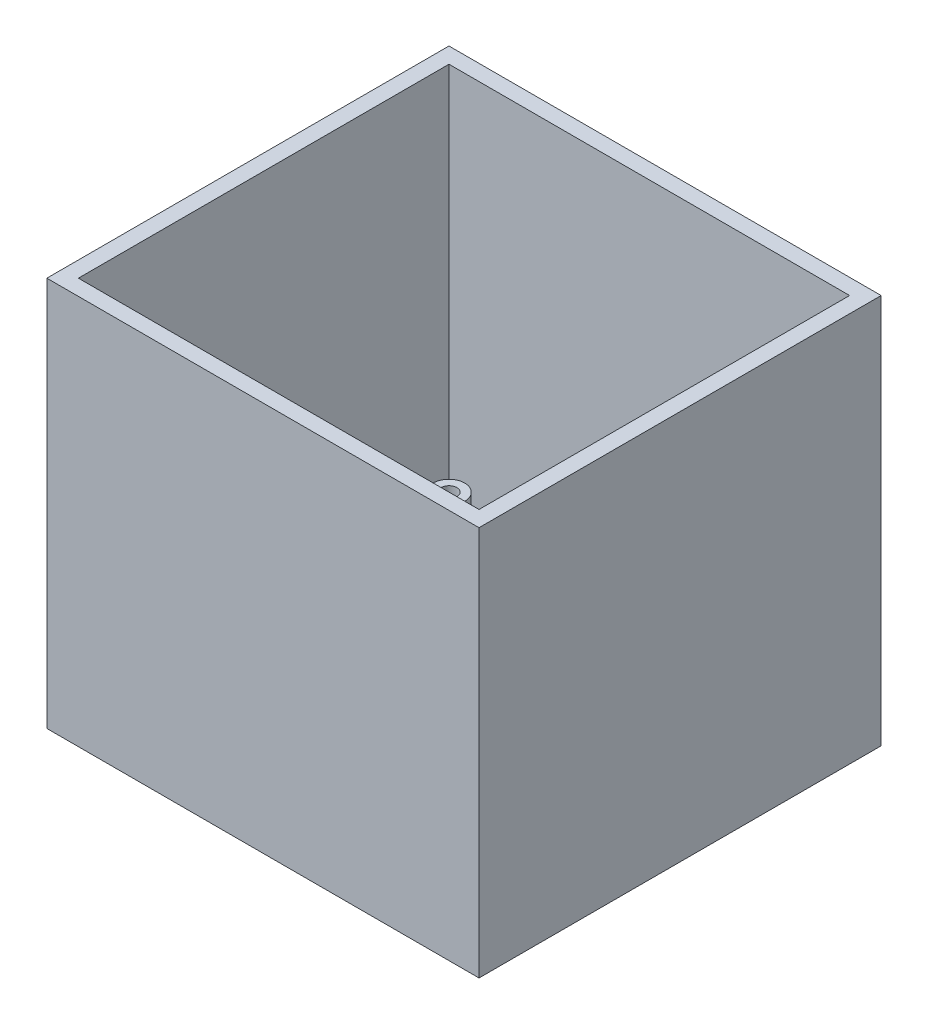
ISO-10303-21;
HEADER;
FILE_DESCRIPTION(('STEP AP214'),'2;1');
FILE_NAME('part.step','',(''),(''),'','','');
FILE_SCHEMA(('AUTOMOTIVE_DESIGN { 1 0 10303 214 1 1 1 1 }'));
ENDSEC;
DATA;
#1=APPLICATION_CONTEXT('core data for automotive mechanical design processes');
#2=APPLICATION_PROTOCOL_DEFINITION('international standard','automotive_design',2000,#1);
#3=PRODUCT_CONTEXT('',#1,'mechanical');
#4=PRODUCT('Part','Part','',(#3));
#5=PRODUCT_RELATED_PRODUCT_CATEGORY('part','',(#4));
#6=PRODUCT_DEFINITION_FORMATION('','',#4);
#7=PRODUCT_DEFINITION_CONTEXT('part definition',#1,'design');
#8=PRODUCT_DEFINITION('design','',#6,#7);
#9=PRODUCT_DEFINITION_SHAPE('','',#8);
#10=(LENGTH_UNIT() NAMED_UNIT(*) SI_UNIT(.MILLI.,.METRE.));
#11=(NAMED_UNIT(*) PLANE_ANGLE_UNIT() SI_UNIT($,.RADIAN.));
#12=(NAMED_UNIT(*) SI_UNIT($,.STERADIAN.) SOLID_ANGLE_UNIT());
#13=UNCERTAINTY_MEASURE_WITH_UNIT(LENGTH_MEASURE(1.E-05),#10,'distance_accuracy_value','');
#14=(GEOMETRIC_REPRESENTATION_CONTEXT(3) GLOBAL_UNCERTAINTY_ASSIGNED_CONTEXT((#13)) GLOBAL_UNIT_ASSIGNED_CONTEXT((#10,
#11,#12)) REPRESENTATION_CONTEXT('',''));
#15=CARTESIAN_POINT('',(0.,0.,0.));
#16=DIRECTION('',(0.,0.,1.));
#17=DIRECTION('',(1.,0.,0.));
#18=AXIS2_PLACEMENT_3D('',#15,#16,#17);
#19=CARTESIAN_POINT('',(0.,2.,0.));
#20=DIRECTION('',(0.,-1.,0.));
#21=DIRECTION('',(0.,0.,-1.));
#22=AXIS2_PLACEMENT_3D('',#19,#20,#21);
#23=PLANE('',#22);
#24=DIRECTION('',(1.,0.,0.));
#25=VECTOR('',#24,1.);
#26=CARTESIAN_POINT('',(-25.400000048,2.,23.495000048));
#27=LINE('',#26,#25);
#28=CARTESIAN_POINT('',(-25.400000048,2.,23.495000048));
#29=VERTEX_POINT('',#28);
#30=CARTESIAN_POINT('',(25.400000048,2.,23.495000048));
#31=VERTEX_POINT('',#30);
#32=EDGE_CURVE('E117',#29,#31,#27,.T.);
#33=ORIENTED_EDGE('',*,*,#32,.T.);
#34=DIRECTION('',(0.,0.,-1.));
#35=VECTOR('',#34,1.);
#36=CARTESIAN_POINT('',(25.400000048,2.,23.495000048));
#37=LINE('',#36,#35);
#38=CARTESIAN_POINT('',(25.400000048,2.,-23.495000048));
#39=VERTEX_POINT('',#38);
#40=EDGE_CURVE('E140',#31,#39,#37,.T.);
#41=ORIENTED_EDGE('',*,*,#40,.T.);
#42=DIRECTION('',(-1.,0.,0.));
#43=VECTOR('',#42,1.);
#44=CARTESIAN_POINT('',(-25.400000048,2.,-23.495000048));
#45=LINE('',#44,#43);
#46=CARTESIAN_POINT('',(-25.400000048,2.,-23.495000048));
#47=VERTEX_POINT('',#46);
#48=EDGE_CURVE('E123',#39,#47,#45,.T.);
#49=ORIENTED_EDGE('',*,*,#48,.T.);
#50=DIRECTION('',(0.,0.,1.));
#51=VECTOR('',#50,1.);
#52=CARTESIAN_POINT('',(-25.400000048,2.,23.495000048));
#53=LINE('',#52,#51);
#54=EDGE_CURVE('E145',#47,#29,#53,.T.);
#55=ORIENTED_EDGE('',*,*,#54,.T.);
#56=EDGE_LOOP('',(#33,#41,#49,#55));
#57=FACE_BOUND('',#56,.T.);
#58=CARTESIAN_POINT('',(-22.8599999999996,2.,20.955));
#59=DIRECTION('',(0.,-1.,0.));
#60=DIRECTION('',(0.,0.,-1.));
#61=AXIS2_PLACEMENT_3D('',#58,#59,#60);
#62=CIRCLE('',#61,2.);
#63=CARTESIAN_POINT('',(-22.8599999999996,2.,18.955));
#64=VERTEX_POINT('',#63);
#65=EDGE_CURVE('E11',#64,#64,#62,.F.);
#66=ORIENTED_EDGE('',*,*,#65,.F.);
#67=EDGE_LOOP('',(#66));
#68=FACE_BOUND('',#67,.T.);
#69=CARTESIAN_POINT('',(22.8600000000004,2.,20.955));
#70=DIRECTION('',(0.,-1.,0.));
#71=DIRECTION('',(0.,0.,-1.));
#72=AXIS2_PLACEMENT_3D('',#69,#70,#71);
#73=CIRCLE('',#72,2.);
#74=CARTESIAN_POINT('',(22.8600000000004,2.,18.955));
#75=VERTEX_POINT('',#74);
#76=EDGE_CURVE('E48',#75,#75,#73,.F.);
#77=ORIENTED_EDGE('',*,*,#76,.F.);
#78=EDGE_LOOP('',(#77));
#79=FACE_BOUND('',#78,.T.);
#80=CARTESIAN_POINT('',(22.86,2.,-20.955));
#81=DIRECTION('',(0.,-1.,0.));
#82=DIRECTION('',(0.,0.,-1.));
#83=AXIS2_PLACEMENT_3D('',#80,#81,#82);
#84=CIRCLE('',#83,2.);
#85=CARTESIAN_POINT('',(22.86,2.,-22.955));
#86=VERTEX_POINT('',#85);
#87=EDGE_CURVE('E252',#86,#86,#84,.F.);
#88=ORIENTED_EDGE('',*,*,#87,.F.);
#89=EDGE_LOOP('',(#88));
#90=FACE_BOUND('',#89,.T.);
#91=CARTESIAN_POINT('',(-22.86,2.,-20.955));
#92=DIRECTION('',(0.,-1.,0.));
#93=DIRECTION('',(0.,0.,-1.));
#94=AXIS2_PLACEMENT_3D('',#91,#92,#93);
#95=CIRCLE('',#94,2.);
#96=CARTESIAN_POINT('',(-22.86,2.,-22.955));
#97=VERTEX_POINT('',#96);
#98=EDGE_CURVE('E248',#97,#97,#95,.F.);
#99=ORIENTED_EDGE('',*,*,#98,.F.);
#100=EDGE_LOOP('',(#99));
#101=FACE_BOUND('',#100,.T.);
#102=ADVANCED_FACE('F39',(#57,#68,#79,#90,#101),#23,.F.);
#103=CARTESIAN_POINT('',(-22.86,5.,-20.955));
#104=DIRECTION('',(0.,1.,0.));
#105=DIRECTION('',(0.,0.,1.));
#106=AXIS2_PLACEMENT_3D('',#103,#104,#105);
#107=PLANE('',#106);
#108=CARTESIAN_POINT('',(-22.86,5.,-20.955));
#109=DIRECTION('',(0.,1.,0.));
#110=DIRECTION('',(0.,0.,1.));
#111=AXIS2_PLACEMENT_3D('',#108,#109,#110);
#112=CIRCLE('',#111,2.);
#113=CARTESIAN_POINT('',(-22.86,5.,-18.955));
#114=VERTEX_POINT('',#113);
#115=EDGE_CURVE('E215',#114,#114,#112,.T.);
#116=ORIENTED_EDGE('',*,*,#115,.T.);
#117=EDGE_LOOP('',(#116));
#118=FACE_BOUND('',#117,.T.);
#119=CARTESIAN_POINT('',(-22.86,5.,-20.955));
#120=DIRECTION('',(0.,1.,0.));
#121=DIRECTION('',(0.,0.,1.));
#122=AXIS2_PLACEMENT_3D('',#119,#120,#121);
#123=CIRCLE('',#122,1.);
#124=CARTESIAN_POINT('',(-22.86,5.,-19.955));
#125=VERTEX_POINT('',#124);
#126=EDGE_CURVE('E211',#125,#125,#123,.T.);
#127=ORIENTED_EDGE('',*,*,#126,.F.);
#128=EDGE_LOOP('',(#127));
#129=FACE_BOUND('',#128,.T.);
#130=ADVANCED_FACE('F263',(#118,#129),#107,.T.);
#131=CARTESIAN_POINT('',(-22.86,5.,-20.955));
#132=DIRECTION('',(0.,-1.,0.));
#133=DIRECTION('',(0.,0.,-1.));
#134=AXIS2_PLACEMENT_3D('',#131,#132,#133);
#135=CYLINDRICAL_SURFACE('',#134,2.);
#136=ORIENTED_EDGE('',*,*,#115,.F.);
#137=EDGE_LOOP('',(#136));
#138=FACE_BOUND('',#137,.T.);
#139=ORIENTED_EDGE('',*,*,#98,.T.);
#140=EDGE_LOOP('',(#139));
#141=FACE_BOUND('',#140,.T.);
#142=ADVANCED_FACE('F272',(#138,#141),#135,.T.);
#143=CARTESIAN_POINT('',(-22.86,5.,-20.955));
#144=DIRECTION('',(0.,-1.,0.));
#145=DIRECTION('',(0.,0.,-1.));
#146=AXIS2_PLACEMENT_3D('',#143,#144,#145);
#147=CYLINDRICAL_SURFACE('',#146,1.);
#148=ORIENTED_EDGE('',*,*,#126,.T.);
#149=EDGE_LOOP('',(#148));
#150=FACE_BOUND('',#149,.T.);
#151=CARTESIAN_POINT('',(-22.86,2.,-20.955));
#152=DIRECTION('',(0.,1.,0.));
#153=DIRECTION('',(0.,0.,1.));
#154=AXIS2_PLACEMENT_3D('',#151,#152,#153);
#155=CIRCLE('',#154,1.);
#156=CARTESIAN_POINT('',(-22.86,2.,-19.955));
#157=VERTEX_POINT('',#156);
#158=EDGE_CURVE('E210',#157,#157,#155,.T.);
#159=ORIENTED_EDGE('',*,*,#158,.F.);
#160=EDGE_LOOP('',(#159));
#161=FACE_BOUND('',#160,.T.);
#162=ADVANCED_FACE('F274',(#150,#161),#147,.F.);
#163=ORIENTED_EDGE('',*,*,#158,.T.);
#164=EDGE_LOOP('',(#163));
#165=FACE_BOUND('',#164,.T.);
#166=ADVANCED_FACE('F267',(#165),#23,.F.);
#167=CARTESIAN_POINT('',(22.86,5.,-20.955));
#168=DIRECTION('',(0.,1.,0.));
#169=DIRECTION('',(0.,0.,1.));
#170=AXIS2_PLACEMENT_3D('',#167,#168,#169);
#171=PLANE('',#170);
#172=CARTESIAN_POINT('',(22.86,5.,-20.955));
#173=DIRECTION('',(0.,1.,0.));
#174=DIRECTION('',(0.,0.,1.));
#175=AXIS2_PLACEMENT_3D('',#172,#173,#174);
#176=CIRCLE('',#175,2.);
#177=CARTESIAN_POINT('',(22.86,5.,-18.955));
#178=VERTEX_POINT('',#177);
#179=EDGE_CURVE('E203',#178,#178,#176,.T.);
#180=ORIENTED_EDGE('',*,*,#179,.T.);
#181=EDGE_LOOP('',(#180));
#182=FACE_BOUND('',#181,.T.);
#183=CARTESIAN_POINT('',(22.86,5.,-20.955));
#184=DIRECTION('',(0.,1.,0.));
#185=DIRECTION('',(0.,0.,1.));
#186=AXIS2_PLACEMENT_3D('',#183,#184,#185);
#187=CIRCLE('',#186,1.);
#188=CARTESIAN_POINT('',(22.86,5.,-19.955));
#189=VERTEX_POINT('',#188);
#190=EDGE_CURVE('E199',#189,#189,#187,.T.);
#191=ORIENTED_EDGE('',*,*,#190,.F.);
#192=EDGE_LOOP('',(#191));
#193=FACE_BOUND('',#192,.T.);
#194=ADVANCED_FACE('F352',(#182,#193),#171,.T.);
#195=CARTESIAN_POINT('',(22.86,5.,-20.955));
#196=DIRECTION('',(0.,-1.,0.));
#197=DIRECTION('',(0.,0.,-1.));
#198=AXIS2_PLACEMENT_3D('',#195,#196,#197);
#199=CYLINDRICAL_SURFACE('',#198,2.);
#200=ORIENTED_EDGE('',*,*,#179,.F.);
#201=EDGE_LOOP('',(#200));
#202=FACE_BOUND('',#201,.T.);
#203=ORIENTED_EDGE('',*,*,#87,.T.);
#204=EDGE_LOOP('',(#203));
#205=FACE_BOUND('',#204,.T.);
#206=ADVANCED_FACE('F350',(#202,#205),#199,.T.);
#207=CARTESIAN_POINT('',(22.86,5.,-20.955));
#208=DIRECTION('',(0.,-1.,0.));
#209=DIRECTION('',(0.,0.,-1.));
#210=AXIS2_PLACEMENT_3D('',#207,#208,#209);
#211=CYLINDRICAL_SURFACE('',#210,1.);
#212=ORIENTED_EDGE('',*,*,#190,.T.);
#213=EDGE_LOOP('',(#212));
#214=FACE_BOUND('',#213,.T.);
#215=CARTESIAN_POINT('',(22.86,2.,-20.955));
#216=DIRECTION('',(0.,1.,0.));
#217=DIRECTION('',(0.,0.,1.));
#218=AXIS2_PLACEMENT_3D('',#215,#216,#217);
#219=CIRCLE('',#218,1.);
#220=CARTESIAN_POINT('',(22.86,2.,-19.955));
#221=VERTEX_POINT('',#220);
#222=EDGE_CURVE('E198',#221,#221,#219,.T.);
#223=ORIENTED_EDGE('',*,*,#222,.F.);
#224=EDGE_LOOP('',(#223));
#225=FACE_BOUND('',#224,.T.);
#226=ADVANCED_FACE('F347',(#214,#225),#211,.F.);
#227=ORIENTED_EDGE('',*,*,#222,.T.);
#228=EDGE_LOOP('',(#227));
#229=FACE_BOUND('',#228,.T.);
#230=ADVANCED_FACE('F342',(#229),#23,.F.);
#231=CARTESIAN_POINT('',(22.8600000000004,5.,20.955));
#232=DIRECTION('',(0.,1.,0.));
#233=DIRECTION('',(0.,0.,1.));
#234=AXIS2_PLACEMENT_3D('',#231,#232,#233);
#235=PLANE('',#234);
#236=CARTESIAN_POINT('',(22.8600000000004,5.,20.955));
#237=DIRECTION('',(0.,1.,0.));
#238=DIRECTION('',(0.,0.,1.));
#239=AXIS2_PLACEMENT_3D('',#236,#237,#238);
#240=CIRCLE('',#239,2.);
#241=CARTESIAN_POINT('',(22.8600000000004,5.,22.955));
#242=VERTEX_POINT('',#241);
#243=EDGE_CURVE('E191',#242,#242,#240,.T.);
#244=ORIENTED_EDGE('',*,*,#243,.T.);
#245=EDGE_LOOP('',(#244));
#246=FACE_BOUND('',#245,.T.);
#247=CARTESIAN_POINT('',(22.8600000000004,5.,20.955));
#248=DIRECTION('',(0.,1.,0.));
#249=DIRECTION('',(0.,0.,1.));
#250=AXIS2_PLACEMENT_3D('',#247,#248,#249);
#251=CIRCLE('',#250,1.);
#252=CARTESIAN_POINT('',(22.8600000000004,5.,21.955));
#253=VERTEX_POINT('',#252);
#254=EDGE_CURVE('E187',#253,#253,#251,.T.);
#255=ORIENTED_EDGE('',*,*,#254,.F.);
#256=EDGE_LOOP('',(#255));
#257=FACE_BOUND('',#256,.T.);
#258=ADVANCED_FACE('F339',(#246,#257),#235,.T.);
#259=CARTESIAN_POINT('',(22.8600000000004,5.,20.955));
#260=DIRECTION('',(0.,-1.,0.));
#261=DIRECTION('',(0.,0.,-1.));
#262=AXIS2_PLACEMENT_3D('',#259,#260,#261);
#263=CYLINDRICAL_SURFACE('',#262,2.);
#264=ORIENTED_EDGE('',*,*,#243,.F.);
#265=EDGE_LOOP('',(#264));
#266=FACE_BOUND('',#265,.T.);
#267=ORIENTED_EDGE('',*,*,#76,.T.);
#268=EDGE_LOOP('',(#267));
#269=FACE_BOUND('',#268,.T.);
#270=ADVANCED_FACE('F259',(#266,#269),#263,.T.);
#271=CARTESIAN_POINT('',(22.8600000000004,5.,20.955));
#272=DIRECTION('',(0.,-1.,0.));
#273=DIRECTION('',(0.,0.,-1.));
#274=AXIS2_PLACEMENT_3D('',#271,#272,#273);
#275=CYLINDRICAL_SURFACE('',#274,1.);
#276=ORIENTED_EDGE('',*,*,#254,.T.);
#277=EDGE_LOOP('',(#276));
#278=FACE_BOUND('',#277,.T.);
#279=CARTESIAN_POINT('',(22.8600000000004,2.,20.955));
#280=DIRECTION('',(0.,1.,0.));
#281=DIRECTION('',(0.,0.,1.));
#282=AXIS2_PLACEMENT_3D('',#279,#280,#281);
#283=CIRCLE('',#282,1.);
#284=CARTESIAN_POINT('',(22.8600000000004,2.,21.955));
#285=VERTEX_POINT('',#284);
#286=EDGE_CURVE('E186',#285,#285,#283,.T.);
#287=ORIENTED_EDGE('',*,*,#286,.F.);
#288=EDGE_LOOP('',(#287));
#289=FACE_BOUND('',#288,.T.);
#290=ADVANCED_FACE('F335',(#278,#289),#275,.F.);
#291=ORIENTED_EDGE('',*,*,#286,.T.);
#292=EDGE_LOOP('',(#291));
#293=FACE_BOUND('',#292,.T.);
#294=ADVANCED_FACE('F321',(#293),#23,.F.);
#295=CARTESIAN_POINT('',(-22.8599999999996,5.,20.955));
#296=DIRECTION('',(0.,1.,0.));
#297=DIRECTION('',(0.,0.,1.));
#298=AXIS2_PLACEMENT_3D('',#295,#296,#297);
#299=PLANE('',#298);
#300=CARTESIAN_POINT('',(-22.8599999999996,5.,20.955));
#301=DIRECTION('',(0.,1.,0.));
#302=DIRECTION('',(0.,0.,1.));
#303=AXIS2_PLACEMENT_3D('',#300,#301,#302);
#304=CIRCLE('',#303,2.);
#305=CARTESIAN_POINT('',(-22.8599999999996,5.,22.955));
#306=VERTEX_POINT('',#305);
#307=EDGE_CURVE('E179',#306,#306,#304,.T.);
#308=ORIENTED_EDGE('',*,*,#307,.T.);
#309=EDGE_LOOP('',(#308));
#310=FACE_BOUND('',#309,.T.);
#311=CARTESIAN_POINT('',(-22.8599999999996,5.,20.955));
#312=DIRECTION('',(0.,1.,0.));
#313=DIRECTION('',(0.,0.,1.));
#314=AXIS2_PLACEMENT_3D('',#311,#312,#313);
#315=CIRCLE('',#314,1.);
#316=CARTESIAN_POINT('',(-22.8599999999996,5.,21.955));
#317=VERTEX_POINT('',#316);
#318=EDGE_CURVE('E175',#317,#317,#315,.T.);
#319=ORIENTED_EDGE('',*,*,#318,.F.);
#320=EDGE_LOOP('',(#319));
#321=FACE_BOUND('',#320,.T.);
#322=ADVANCED_FACE('F328',(#310,#321),#299,.T.);
#323=CARTESIAN_POINT('',(-22.8599999999996,5.,20.955));
#324=DIRECTION('',(0.,-1.,0.));
#325=DIRECTION('',(0.,0.,-1.));
#326=AXIS2_PLACEMENT_3D('',#323,#324,#325);
#327=CYLINDRICAL_SURFACE('',#326,2.);
#328=ORIENTED_EDGE('',*,*,#307,.F.);
#329=EDGE_LOOP('',(#328));
#330=FACE_BOUND('',#329,.T.);
#331=ORIENTED_EDGE('',*,*,#65,.T.);
#332=EDGE_LOOP('',(#331));
#333=FACE_BOUND('',#332,.T.);
#334=ADVANCED_FACE('F326',(#330,#333),#327,.T.);
#335=CARTESIAN_POINT('',(-22.8599999999996,5.,20.955));
#336=DIRECTION('',(0.,-1.,0.));
#337=DIRECTION('',(0.,0.,-1.));
#338=AXIS2_PLACEMENT_3D('',#335,#336,#337);
#339=CYLINDRICAL_SURFACE('',#338,1.);
#340=ORIENTED_EDGE('',*,*,#318,.T.);
#341=EDGE_LOOP('',(#340));
#342=FACE_BOUND('',#341,.T.);
#343=CARTESIAN_POINT('',(-22.8599999999996,2.,20.955));
#344=DIRECTION('',(0.,1.,0.));
#345=DIRECTION('',(0.,0.,1.));
#346=AXIS2_PLACEMENT_3D('',#343,#344,#345);
#347=CIRCLE('',#346,1.);
#348=CARTESIAN_POINT('',(-22.8599999999996,2.,21.955));
#349=VERTEX_POINT('',#348);
#350=EDGE_CURVE('E174',#349,#349,#347,.T.);
#351=ORIENTED_EDGE('',*,*,#350,.F.);
#352=EDGE_LOOP('',(#351));
#353=FACE_BOUND('',#352,.T.);
#354=ADVANCED_FACE('F319',(#342,#353),#339,.F.);
#355=ORIENTED_EDGE('',*,*,#350,.T.);
#356=EDGE_LOOP('',(#355));
#357=FACE_BOUND('',#356,.T.);
#358=ADVANCED_FACE('F266',(#357),#23,.F.);
#359=CARTESIAN_POINT('',(0.,49.45,0.));
#360=DIRECTION('',(0.,-1.,0.));
#361=DIRECTION('',(0.,0.,-1.));
#362=AXIS2_PLACEMENT_3D('',#359,#360,#361);
#363=PLANE('',#362);
#364=DIRECTION('',(0.,0.,-1.));
#365=VECTOR('',#364,1.);
#366=CARTESIAN_POINT('',(27.400000048,49.45,25.495000048));
#367=LINE('',#366,#365);
#368=CARTESIAN_POINT('',(27.400000048,49.45,25.495000048));
#369=VERTEX_POINT('',#368);
#370=CARTESIAN_POINT('',(27.400000048,49.45,-25.495000048));
#371=VERTEX_POINT('',#370);
#372=EDGE_CURVE('E125',#369,#371,#367,.T.);
#373=ORIENTED_EDGE('',*,*,#372,.T.);
#374=DIRECTION('',(-1.,0.,0.));
#375=VECTOR('',#374,1.);
#376=CARTESIAN_POINT('',(-27.400000048,49.45,-25.495000048));
#377=LINE('',#376,#375);
#378=CARTESIAN_POINT('',(-27.400000048,49.45,-25.495000048));
#379=VERTEX_POINT('',#378);
#380=EDGE_CURVE('E162',#371,#379,#377,.T.);
#381=ORIENTED_EDGE('',*,*,#380,.T.);
#382=DIRECTION('',(0.,0.,1.));
#383=VECTOR('',#382,1.);
#384=CARTESIAN_POINT('',(-27.400000048,49.45,25.495000048));
#385=LINE('',#384,#383);
#386=CARTESIAN_POINT('',(-27.400000048,49.45,25.495000048));
#387=VERTEX_POINT('',#386);
#388=EDGE_CURVE('E166',#379,#387,#385,.T.);
#389=ORIENTED_EDGE('',*,*,#388,.T.);
#390=DIRECTION('',(1.,0.,0.));
#391=VECTOR('',#390,1.);
#392=CARTESIAN_POINT('',(-27.400000048,49.45,25.495000048));
#393=LINE('',#392,#391);
#394=EDGE_CURVE('E170',#387,#369,#393,.T.);
#395=ORIENTED_EDGE('',*,*,#394,.T.);
#396=EDGE_LOOP('',(#373,#381,#389,#395));
#397=FACE_BOUND('',#396,.T.);
#398=DIRECTION('',(0.,0.,-1.));
#399=VECTOR('',#398,1.);
#400=CARTESIAN_POINT('',(25.400000048,49.45,23.495000048));
#401=LINE('',#400,#399);
#402=CARTESIAN_POINT('',(25.400000048,49.45,23.495000048));
#403=VERTEX_POINT('',#402);
#404=CARTESIAN_POINT('',(25.400000048,49.45,-23.495000048));
#405=VERTEX_POINT('',#404);
#406=EDGE_CURVE('E107',#403,#405,#401,.T.);
#407=ORIENTED_EDGE('',*,*,#406,.F.);
#408=DIRECTION('',(1.,0.,0.));
#409=VECTOR('',#408,1.);
#410=CARTESIAN_POINT('',(-25.400000048,49.45,23.495000048));
#411=LINE('',#410,#409);
#412=CARTESIAN_POINT('',(-25.400000048,49.45,23.495000048));
#413=VERTEX_POINT('',#412);
#414=EDGE_CURVE('E135',#413,#403,#411,.T.);
#415=ORIENTED_EDGE('',*,*,#414,.F.);
#416=DIRECTION('',(0.,0.,1.));
#417=VECTOR('',#416,1.);
#418=CARTESIAN_POINT('',(-25.400000048,49.45,23.495000048));
#419=LINE('',#418,#417);
#420=CARTESIAN_POINT('',(-25.400000048,49.45,-23.495000048));
#421=VERTEX_POINT('',#420);
#422=EDGE_CURVE('E131',#421,#413,#419,.T.);
#423=ORIENTED_EDGE('',*,*,#422,.F.);
#424=DIRECTION('',(-1.,0.,0.));
#425=VECTOR('',#424,1.);
#426=CARTESIAN_POINT('',(-25.400000048,49.45,-23.495000048));
#427=LINE('',#426,#425);
#428=EDGE_CURVE('E116',#405,#421,#427,.T.);
#429=ORIENTED_EDGE('',*,*,#428,.F.);
#430=EDGE_LOOP('',(#407,#415,#423,#429));
#431=FACE_BOUND('',#430,.T.);
#432=ADVANCED_FACE('F129',(#397,#431),#363,.F.);
#433=CARTESIAN_POINT('',(25.400000048,49.45,23.495000048));
#434=DIRECTION('',(-1.,0.,0.));
#435=DIRECTION('',(0.,0.,1.));
#436=AXIS2_PLACEMENT_3D('',#433,#434,#435);
#437=PLANE('',#436);
#438=ORIENTED_EDGE('',*,*,#40,.F.);
#439=DIRECTION('',(0.,-1.,0.));
#440=VECTOR('',#439,1.);
#441=CARTESIAN_POINT('',(25.400000048,49.45,23.495000048));
#442=LINE('',#441,#440);
#443=EDGE_CURVE('E55',#403,#31,#442,.T.);
#444=ORIENTED_EDGE('',*,*,#443,.F.);
#445=ORIENTED_EDGE('',*,*,#406,.T.);
#446=DIRECTION('',(0.,-1.,0.));
#447=VECTOR('',#446,1.);
#448=CARTESIAN_POINT('',(25.400000048,49.45,-23.495000048));
#449=LINE('',#448,#447);
#450=EDGE_CURVE('E110',#405,#39,#449,.T.);
#451=ORIENTED_EDGE('',*,*,#450,.T.);
#452=EDGE_LOOP('',(#438,#444,#445,#451));
#453=FACE_BOUND('',#452,.T.);
#454=ADVANCED_FACE('F109',(#453),#437,.T.);
#455=CARTESIAN_POINT('',(-25.400000048,49.45,-23.495000048));
#456=DIRECTION('',(0.,0.,1.));
#457=DIRECTION('',(1.,0.,0.));
#458=AXIS2_PLACEMENT_3D('',#455,#456,#457);
#459=PLANE('',#458);
#460=ORIENTED_EDGE('',*,*,#48,.F.);
#461=ORIENTED_EDGE('',*,*,#450,.F.);
#462=ORIENTED_EDGE('',*,*,#428,.T.);
#463=DIRECTION('',(0.,-1.,0.));
#464=VECTOR('',#463,1.);
#465=CARTESIAN_POINT('',(-25.400000048,49.45,-23.495000048));
#466=LINE('',#465,#464);
#467=EDGE_CURVE('E126',#421,#47,#466,.T.);
#468=ORIENTED_EDGE('',*,*,#467,.T.);
#469=EDGE_LOOP('',(#460,#461,#462,#468));
#470=FACE_BOUND('',#469,.T.);
#471=ADVANCED_FACE('F120',(#470),#459,.T.);
#472=CARTESIAN_POINT('',(-25.400000048,49.45,23.495000048));
#473=DIRECTION('',(1.,0.,0.));
#474=DIRECTION('',(0.,0.,-1.));
#475=AXIS2_PLACEMENT_3D('',#472,#473,#474);
#476=PLANE('',#475);
#477=ORIENTED_EDGE('',*,*,#54,.F.);
#478=ORIENTED_EDGE('',*,*,#467,.F.);
#479=ORIENTED_EDGE('',*,*,#422,.T.);
#480=DIRECTION('',(0.,-1.,0.));
#481=VECTOR('',#480,1.);
#482=CARTESIAN_POINT('',(-25.400000048,49.45,23.495000048));
#483=LINE('',#482,#481);
#484=EDGE_CURVE('E154',#413,#29,#483,.T.);
#485=ORIENTED_EDGE('',*,*,#484,.T.);
#486=EDGE_LOOP('',(#477,#478,#479,#485));
#487=FACE_BOUND('',#486,.T.);
#488=ADVANCED_FACE('F424',(#487),#476,.T.);
#489=CARTESIAN_POINT('',(-25.400000048,49.45,23.495000048));
#490=DIRECTION('',(0.,0.,-1.));
#491=DIRECTION('',(-1.,0.,0.));
#492=AXIS2_PLACEMENT_3D('',#489,#490,#491);
#493=PLANE('',#492);
#494=ORIENTED_EDGE('',*,*,#32,.F.);
#495=ORIENTED_EDGE('',*,*,#484,.F.);
#496=ORIENTED_EDGE('',*,*,#414,.T.);
#497=ORIENTED_EDGE('',*,*,#443,.T.);
#498=EDGE_LOOP('',(#494,#495,#496,#497));
#499=FACE_BOUND('',#498,.T.);
#500=ADVANCED_FACE('F291',(#499),#493,.T.);
#501=CARTESIAN_POINT('',(0.,0.,0.));
#502=DIRECTION('',(0.,-1.,0.));
#503=DIRECTION('',(0.,0.,-1.));
#504=AXIS2_PLACEMENT_3D('',#501,#502,#503);
#505=PLANE('',#504);
#506=DIRECTION('',(0.,0.,-1.));
#507=VECTOR('',#506,1.);
#508=CARTESIAN_POINT('',(27.400000048,0.,25.495000048));
#509=LINE('',#508,#507);
#510=CARTESIAN_POINT('',(27.400000048,0.,25.495000048));
#511=VERTEX_POINT('',#510);
#512=CARTESIAN_POINT('',(27.400000048,0.,-25.495000048));
#513=VERTEX_POINT('',#512);
#514=EDGE_CURVE('E222',#511,#513,#509,.T.);
#515=ORIENTED_EDGE('',*,*,#514,.F.);
#516=DIRECTION('',(1.,0.,0.));
#517=VECTOR('',#516,1.);
#518=CARTESIAN_POINT('',(-27.400000048,0.,25.495000048));
#519=LINE('',#518,#517);
#520=CARTESIAN_POINT('',(-27.400000048,0.,25.495000048));
#521=VERTEX_POINT('',#520);
#522=EDGE_CURVE('E63',#521,#511,#519,.T.);
#523=ORIENTED_EDGE('',*,*,#522,.F.);
#524=DIRECTION('',(0.,0.,1.));
#525=VECTOR('',#524,1.);
#526=CARTESIAN_POINT('',(-27.400000048,0.,25.495000048));
#527=LINE('',#526,#525);
#528=CARTESIAN_POINT('',(-27.400000048,0.,-25.495000048));
#529=VERTEX_POINT('',#528);
#530=EDGE_CURVE('E229',#529,#521,#527,.T.);
#531=ORIENTED_EDGE('',*,*,#530,.F.);
#532=DIRECTION('',(-1.,0.,0.));
#533=VECTOR('',#532,1.);
#534=CARTESIAN_POINT('',(-27.400000048,0.,-25.495000048));
#535=LINE('',#534,#533);
#536=EDGE_CURVE('E226',#513,#529,#535,.T.);
#537=ORIENTED_EDGE('',*,*,#536,.F.);
#538=EDGE_LOOP('',(#515,#523,#531,#537));
#539=FACE_BOUND('',#538,.T.);
#540=ADVANCED_FACE('F287',(#539),#505,.T.);
#541=CARTESIAN_POINT('',(-27.400000048,2.,25.495000048));
#542=DIRECTION('',(0.,0.,-1.));
#543=DIRECTION('',(-1.,0.,0.));
#544=AXIS2_PLACEMENT_3D('',#541,#542,#543);
#545=PLANE('',#544);
#546=ORIENTED_EDGE('',*,*,#522,.T.);
#547=DIRECTION('',(0.,-1.,0.));
#548=VECTOR('',#547,1.);
#549=CARTESIAN_POINT('',(27.400000048,2.,25.495000048));
#550=LINE('',#549,#548);
#551=EDGE_CURVE('E234',#369,#511,#550,.T.);
#552=ORIENTED_EDGE('',*,*,#551,.F.);
#553=ORIENTED_EDGE('',*,*,#394,.F.);
#554=DIRECTION('',(0.,-1.,0.));
#555=VECTOR('',#554,1.);
#556=CARTESIAN_POINT('',(-27.400000048,2.,25.495000048));
#557=LINE('',#556,#555);
#558=EDGE_CURVE('E237',#387,#521,#557,.T.);
#559=ORIENTED_EDGE('',*,*,#558,.T.);
#560=EDGE_LOOP('',(#546,#552,#553,#559));
#561=FACE_BOUND('',#560,.T.);
#562=ADVANCED_FACE('F290',(#561),#545,.F.);
#563=CARTESIAN_POINT('',(-27.400000048,2.,25.495000048));
#564=DIRECTION('',(1.,0.,0.));
#565=DIRECTION('',(0.,0.,-1.));
#566=AXIS2_PLACEMENT_3D('',#563,#564,#565);
#567=PLANE('',#566);
#568=ORIENTED_EDGE('',*,*,#530,.T.);
#569=ORIENTED_EDGE('',*,*,#558,.F.);
#570=ORIENTED_EDGE('',*,*,#388,.F.);
#571=DIRECTION('',(0.,-1.,0.));
#572=VECTOR('',#571,1.);
#573=CARTESIAN_POINT('',(-27.400000048,2.,-25.495000048));
#574=LINE('',#573,#572);
#575=EDGE_CURVE('E240',#379,#529,#574,.T.);
#576=ORIENTED_EDGE('',*,*,#575,.T.);
#577=EDGE_LOOP('',(#568,#569,#570,#576));
#578=FACE_BOUND('',#577,.T.);
#579=ADVANCED_FACE('F295',(#578),#567,.F.);
#580=CARTESIAN_POINT('',(-27.400000048,2.,-25.495000048));
#581=DIRECTION('',(0.,0.,1.));
#582=DIRECTION('',(1.,0.,0.));
#583=AXIS2_PLACEMENT_3D('',#580,#581,#582);
#584=PLANE('',#583);
#585=ORIENTED_EDGE('',*,*,#536,.T.);
#586=ORIENTED_EDGE('',*,*,#575,.F.);
#587=ORIENTED_EDGE('',*,*,#380,.F.);
#588=DIRECTION('',(0.,-1.,0.));
#589=VECTOR('',#588,1.);
#590=CARTESIAN_POINT('',(27.400000048,2.,-25.495000048));
#591=LINE('',#590,#589);
#592=EDGE_CURVE('E244',#371,#513,#591,.T.);
#593=ORIENTED_EDGE('',*,*,#592,.T.);
#594=EDGE_LOOP('',(#585,#586,#587,#593));
#595=FACE_BOUND('',#594,.T.);
#596=ADVANCED_FACE('F297',(#595),#584,.F.);
#597=CARTESIAN_POINT('',(27.400000048,2.,25.495000048));
#598=DIRECTION('',(-1.,0.,0.));
#599=DIRECTION('',(0.,0.,1.));
#600=AXIS2_PLACEMENT_3D('',#597,#598,#599);
#601=PLANE('',#600);
#602=ORIENTED_EDGE('',*,*,#514,.T.);
#603=ORIENTED_EDGE('',*,*,#592,.F.);
#604=ORIENTED_EDGE('',*,*,#372,.F.);
#605=ORIENTED_EDGE('',*,*,#551,.T.);
#606=EDGE_LOOP('',(#602,#603,#604,#605));
#607=FACE_BOUND('',#606,.T.);
#608=ADVANCED_FACE('F41',(#607),#601,.F.);
#609=CLOSED_SHELL('',(#102,#130,#142,#162,#166,#194,#206,#226,#230,#258,#270,#290,#294,#322,
#334,#354,#358,#432,#454,#471,#488,#500,#540,#562,#579,#596,#608));
#610=MANIFOLD_SOLID_BREP('B2',#609);
#611=ADVANCED_BREP_SHAPE_REPRESENTATION('',(#18,#610),#14);
#612=SHAPE_DEFINITION_REPRESENTATION(#9,#611);
ENDSEC;
END-ISO-10303-21;
